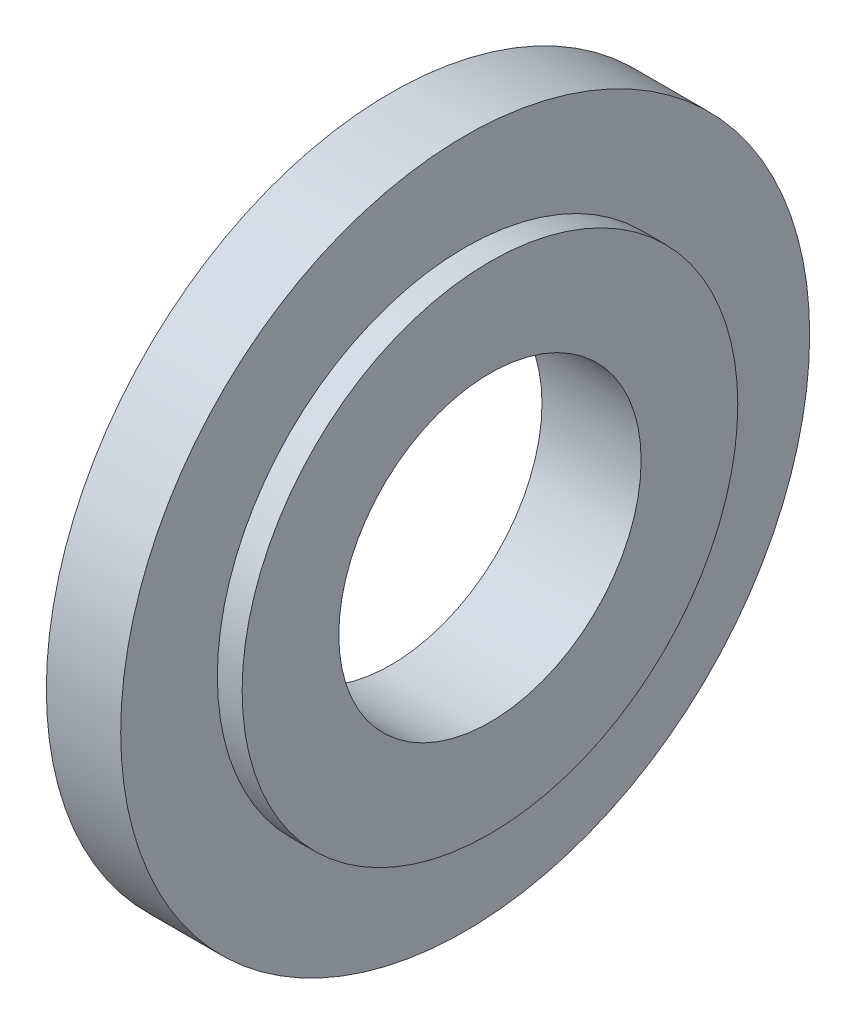
ISO-10303-21;
HEADER;
FILE_DESCRIPTION(('STEP AP214'),'2;1');
FILE_NAME('part.step','',(''),(''),'','','');
FILE_SCHEMA(('AUTOMOTIVE_DESIGN { 1 0 10303 214 1 1 1 1 }'));
ENDSEC;
DATA;
#1=APPLICATION_CONTEXT('core data for automotive mechanical design processes');
#2=APPLICATION_PROTOCOL_DEFINITION('international standard','automotive_design',2000,#1);
#3=PRODUCT_CONTEXT('',#1,'mechanical');
#4=PRODUCT('Part','Part','',(#3));
#5=PRODUCT_RELATED_PRODUCT_CATEGORY('part','',(#4));
#6=PRODUCT_DEFINITION_FORMATION('','',#4);
#7=PRODUCT_DEFINITION_CONTEXT('part definition',#1,'design');
#8=PRODUCT_DEFINITION('design','',#6,#7);
#9=PRODUCT_DEFINITION_SHAPE('','',#8);
#10=(LENGTH_UNIT() NAMED_UNIT(*) SI_UNIT(.MILLI.,.METRE.));
#11=(NAMED_UNIT(*) PLANE_ANGLE_UNIT() SI_UNIT($,.RADIAN.));
#12=(NAMED_UNIT(*) SI_UNIT($,.STERADIAN.) SOLID_ANGLE_UNIT());
#13=UNCERTAINTY_MEASURE_WITH_UNIT(LENGTH_MEASURE(1.E-05),#10,'distance_accuracy_value','');
#14=(GEOMETRIC_REPRESENTATION_CONTEXT(3) GLOBAL_UNCERTAINTY_ASSIGNED_CONTEXT((#13)) GLOBAL_UNIT_ASSIGNED_CONTEXT((#10,
#11,#12)) REPRESENTATION_CONTEXT('',''));
#15=CARTESIAN_POINT('',(0.,0.,0.));
#16=DIRECTION('',(0.,0.,1.));
#17=DIRECTION('',(1.,0.,0.));
#18=AXIS2_PLACEMENT_3D('',#15,#16,#17);
#19=CARTESIAN_POINT('',(-27.2396583474975,10.,0.));
#20=DIRECTION('',(-1.,0.,0.));
#21=DIRECTION('',(0.,0.,1.));
#22=AXIS2_PLACEMENT_3D('',#19,#20,#21);
#23=PLANE('',#22);
#24=CARTESIAN_POINT('',(-27.2396583474975,0.,0.));
#25=DIRECTION('',(-1.,0.,0.));
#26=DIRECTION('',(0.,0.,1.));
#27=AXIS2_PLACEMENT_3D('',#24,#25,#26);
#28=CIRCLE('',#27,10.);
#29=CARTESIAN_POINT('',(-27.2396583474975,0.,10.));
#30=VERTEX_POINT('',#29);
#31=EDGE_CURVE('E47',#30,#30,#28,.T.);
#32=ORIENTED_EDGE('',*,*,#31,.T.);
#33=EDGE_LOOP('',(#32));
#34=FACE_BOUND('',#33,.T.);
#35=CARTESIAN_POINT('',(-27.2396583474975,0.,0.));
#36=DIRECTION('',(-1.,0.,0.));
#37=DIRECTION('',(0.,0.,1.));
#38=AXIS2_PLACEMENT_3D('',#35,#36,#37);
#39=CIRCLE('',#38,13.9);
#40=CARTESIAN_POINT('',(-27.2396583474975,0.,13.9));
#41=VERTEX_POINT('',#40);
#42=EDGE_CURVE('E51',#41,#41,#39,.T.);
#43=ORIENTED_EDGE('',*,*,#42,.F.);
#44=EDGE_LOOP('',(#43));
#45=FACE_BOUND('',#44,.T.);
#46=ADVANCED_FACE('F39',(#34,#45),#23,.F.);
#47=CARTESIAN_POINT('',(-30.2396583474975,20.,0.));
#48=DIRECTION('',(1.,0.,0.));
#49=DIRECTION('',(0.,0.,-1.));
#50=AXIS2_PLACEMENT_3D('',#47,#48,#49);
#51=PLANE('',#50);
#52=CARTESIAN_POINT('',(-30.2396583474975,0.,0.));
#53=DIRECTION('',(1.,0.,0.));
#54=DIRECTION('',(0.,0.,-1.));
#55=AXIS2_PLACEMENT_3D('',#52,#53,#54);
#56=CIRCLE('',#55,6.1);
#57=CARTESIAN_POINT('',(-30.2396583474975,0.,-6.1));
#58=VERTEX_POINT('',#57);
#59=EDGE_CURVE('E59',#58,#58,#56,.T.);
#60=ORIENTED_EDGE('',*,*,#59,.T.);
#61=EDGE_LOOP('',(#60));
#62=FACE_BOUND('',#61,.T.);
#63=CARTESIAN_POINT('',(-30.2396583474975,0.,0.));
#64=DIRECTION('',(1.,0.,0.));
#65=DIRECTION('',(0.,0.,-1.));
#66=AXIS2_PLACEMENT_3D('',#63,#64,#65);
#67=CIRCLE('',#66,13.9);
#68=CARTESIAN_POINT('',(-30.2396583474975,0.,-13.9));
#69=VERTEX_POINT('',#68);
#70=EDGE_CURVE('E56',#69,#69,#67,.T.);
#71=ORIENTED_EDGE('',*,*,#70,.F.);
#72=EDGE_LOOP('',(#71));
#73=FACE_BOUND('',#72,.T.);
#74=ADVANCED_FACE('F81',(#62,#73),#51,.F.);
#75=CARTESIAN_POINT('',(-26.2396583474975,6.,0.));
#76=DIRECTION('',(-1.,0.,0.));
#77=DIRECTION('',(0.,0.,1.));
#78=AXIS2_PLACEMENT_3D('',#75,#76,#77);
#79=PLANE('',#78);
#80=CARTESIAN_POINT('',(-26.2396583474975,0.,0.));
#81=DIRECTION('',(-1.,0.,0.));
#82=DIRECTION('',(0.,0.,1.));
#83=AXIS2_PLACEMENT_3D('',#80,#81,#82);
#84=CIRCLE('',#83,6.1);
#85=CARTESIAN_POINT('',(-26.2396583474975,0.,6.1));
#86=VERTEX_POINT('',#85);
#87=EDGE_CURVE('E43',#86,#86,#84,.T.);
#88=ORIENTED_EDGE('',*,*,#87,.T.);
#89=EDGE_LOOP('',(#88));
#90=FACE_BOUND('',#89,.T.);
#91=CARTESIAN_POINT('',(-26.2396583474975,0.,0.));
#92=DIRECTION('',(-1.,0.,0.));
#93=DIRECTION('',(0.,0.,1.));
#94=AXIS2_PLACEMENT_3D('',#91,#92,#93);
#95=CIRCLE('',#94,10.);
#96=CARTESIAN_POINT('',(-26.2396583474975,0.,10.));
#97=VERTEX_POINT('',#96);
#98=EDGE_CURVE('E10',#97,#97,#95,.T.);
#99=ORIENTED_EDGE('',*,*,#98,.F.);
#100=EDGE_LOOP('',(#99));
#101=FACE_BOUND('',#100,.T.);
#102=ADVANCED_FACE('F41',(#90,#101),#79,.F.);
#103=CARTESIAN_POINT('',(-37.6684331780801,0.,0.));
#104=DIRECTION('',(-1.,0.,0.));
#105=DIRECTION('',(0.,0.,1.));
#106=AXIS2_PLACEMENT_3D('',#103,#104,#105);
#107=CYLINDRICAL_SURFACE('',#106,10.);
#108=ORIENTED_EDGE('',*,*,#31,.F.);
#109=EDGE_LOOP('',(#108));
#110=FACE_BOUND('',#109,.T.);
#111=ORIENTED_EDGE('',*,*,#98,.T.);
#112=EDGE_LOOP('',(#111));
#113=FACE_BOUND('',#112,.T.);
#114=ADVANCED_FACE('F77',(#110,#113),#107,.T.);
#115=CARTESIAN_POINT('',(-30.2396583474975,0.,0.));
#116=DIRECTION('',(1.,0.,0.));
#117=DIRECTION('',(0.,0.,-1.));
#118=AXIS2_PLACEMENT_3D('',#115,#116,#117);
#119=CYLINDRICAL_SURFACE('',#118,13.9);
#120=ORIENTED_EDGE('',*,*,#70,.T.);
#121=EDGE_LOOP('',(#120));
#122=FACE_BOUND('',#121,.T.);
#123=ORIENTED_EDGE('',*,*,#42,.T.);
#124=EDGE_LOOP('',(#123));
#125=FACE_BOUND('',#124,.T.);
#126=ADVANCED_FACE('F70',(#122,#125),#119,.T.);
#127=CARTESIAN_POINT('',(-30.2396583474975,0.,0.));
#128=DIRECTION('',(1.,0.,0.));
#129=DIRECTION('',(0.,0.,-1.));
#130=AXIS2_PLACEMENT_3D('',#127,#128,#129);
#131=CYLINDRICAL_SURFACE('',#130,6.1);
#132=ORIENTED_EDGE('',*,*,#59,.F.);
#133=EDGE_LOOP('',(#132));
#134=FACE_BOUND('',#133,.T.);
#135=ORIENTED_EDGE('',*,*,#87,.F.);
#136=EDGE_LOOP('',(#135));
#137=FACE_BOUND('',#136,.T.);
#138=ADVANCED_FACE('F68',(#134,#137),#131,.F.);
#139=CLOSED_SHELL('',(#46,#74,#102,#114,#126,#138));
#140=MANIFOLD_SOLID_BREP('B2',#139);
#141=ADVANCED_BREP_SHAPE_REPRESENTATION('',(#18,#140),#14);
#142=SHAPE_DEFINITION_REPRESENTATION(#9,#141);
ENDSEC;
END-ISO-10303-21;
